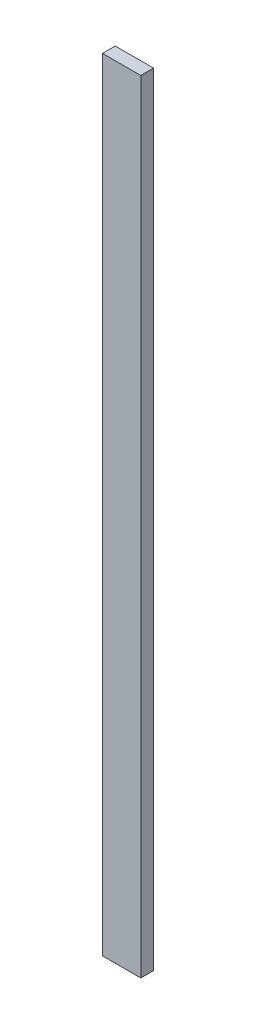
ISO-10303-21;
HEADER;
FILE_DESCRIPTION(('STEP AP214'),'2;1');
FILE_NAME('part.step','',(''),(''),'','','');
FILE_SCHEMA(('AUTOMOTIVE_DESIGN { 1 0 10303 214 1 1 1 1 }'));
ENDSEC;
DATA;
#1=APPLICATION_CONTEXT('core data for automotive mechanical design processes');
#2=APPLICATION_PROTOCOL_DEFINITION('international standard','automotive_design',2000,#1);
#3=PRODUCT_CONTEXT('',#1,'mechanical');
#4=PRODUCT('Part','Part','',(#3));
#5=PRODUCT_RELATED_PRODUCT_CATEGORY('part','',(#4));
#6=PRODUCT_DEFINITION_FORMATION('','',#4);
#7=PRODUCT_DEFINITION_CONTEXT('part definition',#1,'design');
#8=PRODUCT_DEFINITION('design','',#6,#7);
#9=PRODUCT_DEFINITION_SHAPE('','',#8);
#10=(LENGTH_UNIT() NAMED_UNIT(*) SI_UNIT(.MILLI.,.METRE.));
#11=(NAMED_UNIT(*) PLANE_ANGLE_UNIT() SI_UNIT($,.RADIAN.));
#12=(NAMED_UNIT(*) SI_UNIT($,.STERADIAN.) SOLID_ANGLE_UNIT());
#13=UNCERTAINTY_MEASURE_WITH_UNIT(LENGTH_MEASURE(1.E-05),#10,'distance_accuracy_value','');
#14=(GEOMETRIC_REPRESENTATION_CONTEXT(3) GLOBAL_UNCERTAINTY_ASSIGNED_CONTEXT((#13)) GLOBAL_UNIT_ASSIGNED_CONTEXT((#10,
#11,#12)) REPRESENTATION_CONTEXT('',''));
#15=CARTESIAN_POINT('',(0.,0.,0.));
#16=DIRECTION('',(0.,0.,1.));
#17=DIRECTION('',(1.,0.,0.));
#18=AXIS2_PLACEMENT_3D('',#15,#16,#17);
#19=CARTESIAN_POINT('',(0.,0.,4.));
#20=DIRECTION('',(1.,0.,0.));
#21=DIRECTION('',(0.,0.,-1.));
#22=AXIS2_PLACEMENT_3D('',#19,#20,#21);
#23=PLANE('',#22);
#24=DIRECTION('',(0.,-1.,0.));
#25=VECTOR('',#24,1.);
#26=CARTESIAN_POINT('',(0.,0.,0.));
#27=LINE('',#26,#25);
#28=CARTESIAN_POINT('',(0.,245.,0.));
#29=VERTEX_POINT('',#28);
#30=CARTESIAN_POINT('',(0.,0.,0.));
#31=VERTEX_POINT('',#30);
#32=EDGE_CURVE('E105',#29,#31,#27,.T.);
#33=ORIENTED_EDGE('',*,*,#32,.T.);
#34=DIRECTION('',(0.,0.,-1.));
#35=VECTOR('',#34,1.);
#36=CARTESIAN_POINT('',(0.,0.,4.));
#37=LINE('',#36,#35);
#38=CARTESIAN_POINT('',(0.,0.,4.));
#39=VERTEX_POINT('',#38);
#40=EDGE_CURVE('E11',#39,#31,#37,.T.);
#41=ORIENTED_EDGE('',*,*,#40,.F.);
#42=DIRECTION('',(0.,-1.,0.));
#43=VECTOR('',#42,1.);
#44=CARTESIAN_POINT('',(0.,0.,4.));
#45=LINE('',#44,#43);
#46=CARTESIAN_POINT('',(0.,245.,4.));
#47=VERTEX_POINT('',#46);
#48=EDGE_CURVE('E89',#47,#39,#45,.T.);
#49=ORIENTED_EDGE('',*,*,#48,.F.);
#50=DIRECTION('',(0.,0.,-1.));
#51=VECTOR('',#50,1.);
#52=CARTESIAN_POINT('',(0.,245.,4.));
#53=LINE('',#52,#51);
#54=EDGE_CURVE('E97',#47,#29,#53,.T.);
#55=ORIENTED_EDGE('',*,*,#54,.T.);
#56=EDGE_LOOP('',(#33,#41,#49,#55));
#57=FACE_BOUND('',#56,.T.);
#58=ADVANCED_FACE('F39',(#57),#23,.F.);
#59=CARTESIAN_POINT('',(0.,0.,4.));
#60=DIRECTION('',(0.,1.,0.));
#61=DIRECTION('',(0.,0.,1.));
#62=AXIS2_PLACEMENT_3D('',#59,#60,#61);
#63=PLANE('',#62);
#64=DIRECTION('',(1.,0.,0.));
#65=VECTOR('',#64,1.);
#66=CARTESIAN_POINT('',(0.,0.,0.));
#67=LINE('',#66,#65);
#68=CARTESIAN_POINT('',(12.,0.,0.));
#69=VERTEX_POINT('',#68);
#70=EDGE_CURVE('E92',#31,#69,#67,.T.);
#71=ORIENTED_EDGE('',*,*,#70,.T.);
#72=DIRECTION('',(0.,0.,-1.));
#73=VECTOR('',#72,1.);
#74=CARTESIAN_POINT('',(12.,0.,4.));
#75=LINE('',#74,#73);
#76=CARTESIAN_POINT('',(12.,0.,4.));
#77=VERTEX_POINT('',#76);
#78=EDGE_CURVE('E50',#77,#69,#75,.T.);
#79=ORIENTED_EDGE('',*,*,#78,.F.);
#80=DIRECTION('',(1.,0.,0.));
#81=VECTOR('',#80,1.);
#82=CARTESIAN_POINT('',(0.,0.,4.));
#83=LINE('',#82,#81);
#84=EDGE_CURVE('E82',#39,#77,#83,.T.);
#85=ORIENTED_EDGE('',*,*,#84,.F.);
#86=ORIENTED_EDGE('',*,*,#40,.T.);
#87=EDGE_LOOP('',(#71,#79,#85,#86));
#88=FACE_BOUND('',#87,.T.);
#89=ADVANCED_FACE('F93',(#88),#63,.F.);
#90=CARTESIAN_POINT('',(12.,0.,4.));
#91=DIRECTION('',(-1.,0.,0.));
#92=DIRECTION('',(0.,0.,1.));
#93=AXIS2_PLACEMENT_3D('',#90,#91,#92);
#94=PLANE('',#93);
#95=DIRECTION('',(0.,1.,0.));
#96=VECTOR('',#95,1.);
#97=CARTESIAN_POINT('',(12.,0.,0.));
#98=LINE('',#97,#96);
#99=CARTESIAN_POINT('',(12.,245.,0.));
#100=VERTEX_POINT('',#99);
#101=EDGE_CURVE('E72',#69,#100,#98,.T.);
#102=ORIENTED_EDGE('',*,*,#101,.T.);
#103=DIRECTION('',(0.,0.,-1.));
#104=VECTOR('',#103,1.);
#105=CARTESIAN_POINT('',(12.,245.,4.));
#106=LINE('',#105,#104);
#107=CARTESIAN_POINT('',(12.,245.,4.));
#108=VERTEX_POINT('',#107);
#109=EDGE_CURVE('E94',#108,#100,#106,.T.);
#110=ORIENTED_EDGE('',*,*,#109,.F.);
#111=DIRECTION('',(0.,1.,0.));
#112=VECTOR('',#111,1.);
#113=CARTESIAN_POINT('',(12.,0.,4.));
#114=LINE('',#113,#112);
#115=EDGE_CURVE('E88',#77,#108,#114,.T.);
#116=ORIENTED_EDGE('',*,*,#115,.F.);
#117=ORIENTED_EDGE('',*,*,#78,.T.);
#118=EDGE_LOOP('',(#102,#110,#116,#117));
#119=FACE_BOUND('',#118,.T.);
#120=ADVANCED_FACE('F96',(#119),#94,.F.);
#121=CARTESIAN_POINT('',(0.,245.,4.));
#122=DIRECTION('',(0.,-1.,0.));
#123=DIRECTION('',(0.,0.,-1.));
#124=AXIS2_PLACEMENT_3D('',#121,#122,#123);
#125=PLANE('',#124);
#126=DIRECTION('',(-1.,0.,0.));
#127=VECTOR('',#126,1.);
#128=CARTESIAN_POINT('',(0.,245.,0.));
#129=LINE('',#128,#127);
#130=EDGE_CURVE('E76',#100,#29,#129,.T.);
#131=ORIENTED_EDGE('',*,*,#130,.T.);
#132=ORIENTED_EDGE('',*,*,#54,.F.);
#133=DIRECTION('',(-1.,0.,0.));
#134=VECTOR('',#133,1.);
#135=CARTESIAN_POINT('',(0.,245.,4.));
#136=LINE('',#135,#134);
#137=EDGE_CURVE('E54',#108,#47,#136,.T.);
#138=ORIENTED_EDGE('',*,*,#137,.F.);
#139=ORIENTED_EDGE('',*,*,#109,.T.);
#140=EDGE_LOOP('',(#131,#132,#138,#139));
#141=FACE_BOUND('',#140,.T.);
#142=ADVANCED_FACE('F108',(#141),#125,.F.);
#143=CARTESIAN_POINT('',(0.,0.,4.));
#144=DIRECTION('',(0.,0.,-1.));
#145=DIRECTION('',(-1.,0.,0.));
#146=AXIS2_PLACEMENT_3D('',#143,#144,#145);
#147=PLANE('',#146);
#148=ORIENTED_EDGE('',*,*,#48,.T.);
#149=ORIENTED_EDGE('',*,*,#84,.T.);
#150=ORIENTED_EDGE('',*,*,#115,.T.);
#151=ORIENTED_EDGE('',*,*,#137,.T.);
#152=EDGE_LOOP('',(#148,#149,#150,#151));
#153=FACE_BOUND('',#152,.T.);
#154=ADVANCED_FACE('F86',(#153),#147,.F.);
#155=CARTESIAN_POINT('',(0.,0.,0.));
#156=DIRECTION('',(0.,0.,-1.));
#157=DIRECTION('',(-1.,0.,0.));
#158=AXIS2_PLACEMENT_3D('',#155,#156,#157);
#159=PLANE('',#158);
#160=ORIENTED_EDGE('',*,*,#32,.F.);
#161=ORIENTED_EDGE('',*,*,#130,.F.);
#162=ORIENTED_EDGE('',*,*,#101,.F.);
#163=ORIENTED_EDGE('',*,*,#70,.F.);
#164=EDGE_LOOP('',(#160,#161,#162,#163));
#165=FACE_BOUND('',#164,.T.);
#166=ADVANCED_FACE('F115',(#165),#159,.T.);
#167=CLOSED_SHELL('',(#58,#89,#120,#142,#154,#166));
#168=MANIFOLD_SOLID_BREP('B2',#167);
#169=ADVANCED_BREP_SHAPE_REPRESENTATION('',(#18,#168),#14);
#170=SHAPE_DEFINITION_REPRESENTATION(#9,#169);
ENDSEC;
END-ISO-10303-21;
